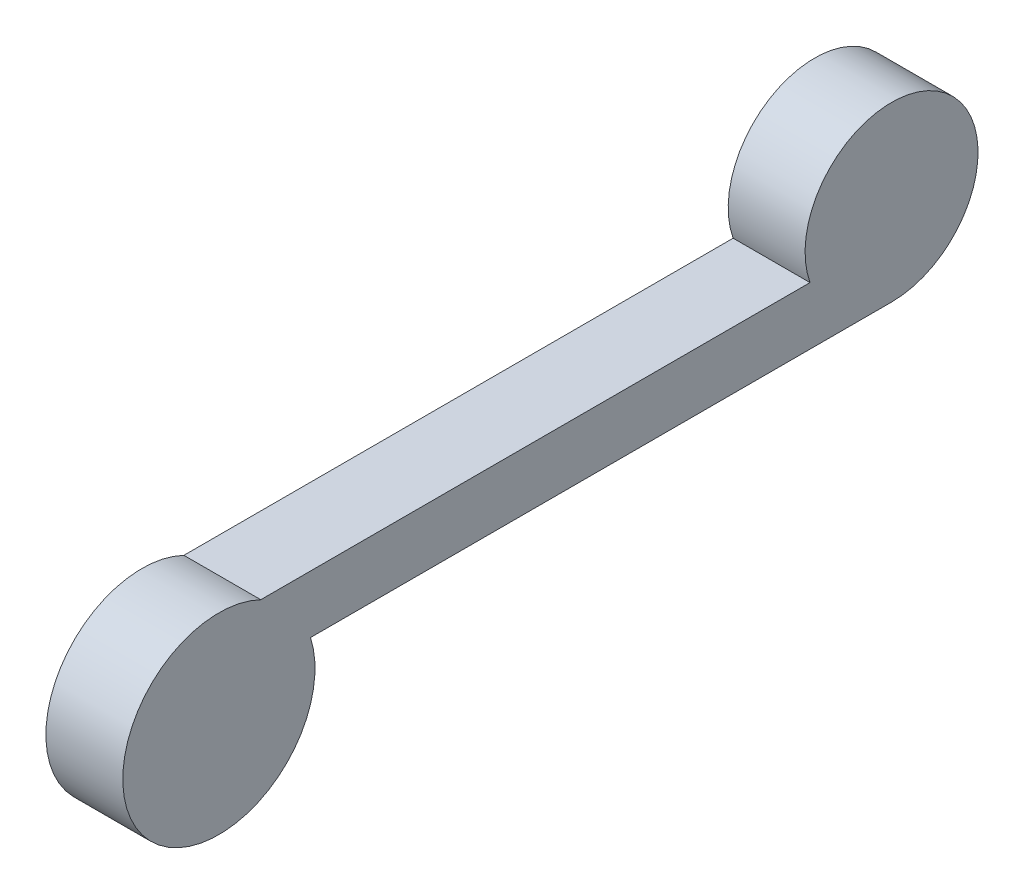
ISO-10303-21;
HEADER;
FILE_DESCRIPTION(('STEP AP214'),'2;1');
FILE_NAME('part.step','',(''),(''),'','','');
FILE_SCHEMA(('AUTOMOTIVE_DESIGN { 1 0 10303 214 1 1 1 1 }'));
ENDSEC;
DATA;
#1=APPLICATION_CONTEXT('core data for automotive mechanical design processes');
#2=APPLICATION_PROTOCOL_DEFINITION('international standard','automotive_design',2000,#1);
#3=PRODUCT_CONTEXT('',#1,'mechanical');
#4=PRODUCT('Part','Part','',(#3));
#5=PRODUCT_RELATED_PRODUCT_CATEGORY('part','',(#4));
#6=PRODUCT_DEFINITION_FORMATION('','',#4);
#7=PRODUCT_DEFINITION_CONTEXT('part definition',#1,'design');
#8=PRODUCT_DEFINITION('design','',#6,#7);
#9=PRODUCT_DEFINITION_SHAPE('','',#8);
#10=(LENGTH_UNIT() NAMED_UNIT(*) SI_UNIT(.MILLI.,.METRE.));
#11=(NAMED_UNIT(*) PLANE_ANGLE_UNIT() SI_UNIT($,.RADIAN.));
#12=(NAMED_UNIT(*) SI_UNIT($,.STERADIAN.) SOLID_ANGLE_UNIT());
#13=UNCERTAINTY_MEASURE_WITH_UNIT(LENGTH_MEASURE(1.E-05),#10,'distance_accuracy_value','');
#14=(GEOMETRIC_REPRESENTATION_CONTEXT(3) GLOBAL_UNCERTAINTY_ASSIGNED_CONTEXT((#13)) GLOBAL_UNIT_ASSIGNED_CONTEXT((#10,
#11,#12)) REPRESENTATION_CONTEXT('',''));
#15=CARTESIAN_POINT('',(0.,0.,0.));
#16=DIRECTION('',(0.,0.,1.));
#17=DIRECTION('',(1.,0.,0.));
#18=AXIS2_PLACEMENT_3D('',#15,#16,#17);
#19=CARTESIAN_POINT('',(20.,0.,0.));
#20=DIRECTION('',(-1.,0.,0.));
#21=DIRECTION('',(0.,0.,1.));
#22=AXIS2_PLACEMENT_3D('',#19,#20,#21);
#23=CYLINDRICAL_SURFACE('',#22,50.);
#24=CARTESIAN_POINT('',(-20.,0.,0.));
#25=DIRECTION('',(1.,0.,0.));
#26=DIRECTION('',(0.,0.,-1.));
#27=AXIS2_PLACEMENT_3D('',#24,#25,#26);
#28=CIRCLE('',#27,50.);
#29=CARTESIAN_POINT('',(-20.,45.,-21.7944947177034));
#30=VERTEX_POINT('',#29);
#31=CARTESIAN_POINT('',(-20.,15.,-47.6969600708473));
#32=VERTEX_POINT('',#31);
#33=EDGE_CURVE('E109',#30,#32,#28,.T.);
#34=ORIENTED_EDGE('',*,*,#33,.T.);
#35=DIRECTION('',(-1.,0.,0.));
#36=VECTOR('',#35,1.);
#37=CARTESIAN_POINT('',(20.,15.,-47.6969600708473));
#38=LINE('',#37,#36);
#39=CARTESIAN_POINT('',(20.,15.,-47.6969600708473));
#40=VERTEX_POINT('',#39);
#41=EDGE_CURVE('E11',#40,#32,#38,.T.);
#42=ORIENTED_EDGE('',*,*,#41,.F.);
#43=CARTESIAN_POINT('',(20.,0.,0.));
#44=DIRECTION('',(1.,0.,0.));
#45=DIRECTION('',(0.,0.,-1.));
#46=AXIS2_PLACEMENT_3D('',#43,#44,#45);
#47=CIRCLE('',#46,50.);
#48=CARTESIAN_POINT('',(20.,45.,-21.7944947177034));
#49=VERTEX_POINT('',#48);
#50=EDGE_CURVE('E91',#49,#40,#47,.T.);
#51=ORIENTED_EDGE('',*,*,#50,.F.);
#52=DIRECTION('',(-1.,0.,0.));
#53=VECTOR('',#52,1.);
#54=CARTESIAN_POINT('',(20.,45.,-21.7944947177034));
#55=LINE('',#54,#53);
#56=EDGE_CURVE('E58',#49,#30,#55,.T.);
#57=ORIENTED_EDGE('',*,*,#56,.T.);
#58=EDGE_LOOP('',(#34,#42,#51,#57));
#59=FACE_BOUND('',#58,.T.);
#60=ADVANCED_FACE('F41',(#59),#23,.T.);
#61=CARTESIAN_POINT('',(20.,15.,0.));
#62=DIRECTION('',(0.,1.,0.));
#63=DIRECTION('',(0.,0.,1.));
#64=AXIS2_PLACEMENT_3D('',#61,#62,#63);
#65=PLANE('',#64);
#66=DIRECTION('',(0.,0.,-1.));
#67=VECTOR('',#66,1.);
#68=CARTESIAN_POINT('',(-20.,15.,0.));
#69=LINE('',#68,#67);
#70=CARTESIAN_POINT('',(-20.,15.,-350.));
#71=VERTEX_POINT('',#70);
#72=EDGE_CURVE('E97',#32,#71,#69,.T.);
#73=ORIENTED_EDGE('',*,*,#72,.T.);
#74=DIRECTION('',(-1.,0.,0.));
#75=VECTOR('',#74,1.);
#76=CARTESIAN_POINT('',(20.,15.,-350.));
#77=LINE('',#76,#75);
#78=CARTESIAN_POINT('',(20.,15.,-350.));
#79=VERTEX_POINT('',#78);
#80=EDGE_CURVE('E50',#79,#71,#77,.T.);
#81=ORIENTED_EDGE('',*,*,#80,.F.);
#82=DIRECTION('',(0.,0.,-1.));
#83=VECTOR('',#82,1.);
#84=CARTESIAN_POINT('',(20.,15.,0.));
#85=LINE('',#84,#83);
#86=EDGE_CURVE('E84',#40,#79,#85,.T.);
#87=ORIENTED_EDGE('',*,*,#86,.F.);
#88=ORIENTED_EDGE('',*,*,#41,.T.);
#89=EDGE_LOOP('',(#73,#81,#87,#88));
#90=FACE_BOUND('',#89,.T.);
#91=ADVANCED_FACE('F96',(#90),#65,.F.);
#92=CARTESIAN_POINT('',(20.,60.,-350.));
#93=DIRECTION('',(-1.,0.,0.));
#94=DIRECTION('',(0.,0.,1.));
#95=AXIS2_PLACEMENT_3D('',#92,#93,#94);
#96=CYLINDRICAL_SURFACE('',#95,45.);
#97=CARTESIAN_POINT('',(-20.,60.,-350.));
#98=DIRECTION('',(1.,0.,0.));
#99=DIRECTION('',(0.,0.,-1.));
#100=AXIS2_PLACEMENT_3D('',#97,#98,#99);
#101=CIRCLE('',#100,45.);
#102=CARTESIAN_POINT('',(-20.,45.,-307.573593128807));
#103=VERTEX_POINT('',#102);
#104=EDGE_CURVE('E114',#71,#103,#101,.T.);
#105=ORIENTED_EDGE('',*,*,#104,.T.);
#106=DIRECTION('',(-1.,0.,0.));
#107=VECTOR('',#106,1.);
#108=CARTESIAN_POINT('',(20.,45.,-307.573593128807));
#109=LINE('',#108,#107);
#110=CARTESIAN_POINT('',(20.,45.,-307.573593128807));
#111=VERTEX_POINT('',#110);
#112=EDGE_CURVE('E73',#111,#103,#109,.T.);
#113=ORIENTED_EDGE('',*,*,#112,.F.);
#114=CARTESIAN_POINT('',(20.,60.,-350.));
#115=DIRECTION('',(1.,0.,0.));
#116=DIRECTION('',(0.,0.,-1.));
#117=AXIS2_PLACEMENT_3D('',#114,#115,#116);
#118=CIRCLE('',#117,45.);
#119=EDGE_CURVE('E90',#79,#111,#118,.T.);
#120=ORIENTED_EDGE('',*,*,#119,.F.);
#121=ORIENTED_EDGE('',*,*,#80,.T.);
#122=EDGE_LOOP('',(#105,#113,#120,#121));
#123=FACE_BOUND('',#122,.T.);
#124=ADVANCED_FACE('F101',(#123),#96,.T.);
#125=CARTESIAN_POINT('',(20.,45.,0.));
#126=DIRECTION('',(0.,1.,0.));
#127=DIRECTION('',(0.,0.,1.));
#128=AXIS2_PLACEMENT_3D('',#125,#126,#127);
#129=PLANE('',#128);
#130=DIRECTION('',(0.,0.,-1.));
#131=VECTOR('',#130,1.);
#132=CARTESIAN_POINT('',(-20.,45.,0.));
#133=LINE('',#132,#131);
#134=EDGE_CURVE('E117',#30,#103,#133,.T.);
#135=ORIENTED_EDGE('',*,*,#134,.F.);
#136=ORIENTED_EDGE('',*,*,#56,.F.);
#137=DIRECTION('',(0.,0.,-1.));
#138=VECTOR('',#137,1.);
#139=CARTESIAN_POINT('',(20.,45.,0.));
#140=LINE('',#139,#138);
#141=EDGE_CURVE('E103',#49,#111,#140,.T.);
#142=ORIENTED_EDGE('',*,*,#141,.T.);
#143=ORIENTED_EDGE('',*,*,#112,.T.);
#144=EDGE_LOOP('',(#135,#136,#142,#143));
#145=FACE_BOUND('',#144,.T.);
#146=ADVANCED_FACE('F127',(#145),#129,.T.);
#147=CARTESIAN_POINT('',(20.,0.,0.));
#148=DIRECTION('',(1.,0.,0.));
#149=DIRECTION('',(0.,0.,-1.));
#150=AXIS2_PLACEMENT_3D('',#147,#148,#149);
#151=PLANE('',#150);
#152=ORIENTED_EDGE('',*,*,#50,.T.);
#153=ORIENTED_EDGE('',*,*,#86,.T.);
#154=ORIENTED_EDGE('',*,*,#119,.T.);
#155=ORIENTED_EDGE('',*,*,#141,.F.);
#156=EDGE_LOOP('',(#152,#153,#154,#155));
#157=FACE_BOUND('',#156,.T.);
#158=ADVANCED_FACE('F87',(#157),#151,.T.);
#159=CARTESIAN_POINT('',(-20.,0.,0.));
#160=DIRECTION('',(1.,0.,0.));
#161=DIRECTION('',(0.,0.,-1.));
#162=AXIS2_PLACEMENT_3D('',#159,#160,#161);
#163=PLANE('',#162);
#164=ORIENTED_EDGE('',*,*,#33,.F.);
#165=ORIENTED_EDGE('',*,*,#134,.T.);
#166=ORIENTED_EDGE('',*,*,#104,.F.);
#167=ORIENTED_EDGE('',*,*,#72,.F.);
#168=EDGE_LOOP('',(#164,#165,#166,#167));
#169=FACE_BOUND('',#168,.T.);
#170=ADVANCED_FACE('F126',(#169),#163,.F.);
#171=CLOSED_SHELL('',(#60,#91,#124,#146,#158,#170));
#172=MANIFOLD_SOLID_BREP('B2',#171);
#173=ADVANCED_BREP_SHAPE_REPRESENTATION('',(#18,#172),#14);
#174=SHAPE_DEFINITION_REPRESENTATION(#9,#173);
ENDSEC;
END-ISO-10303-21;
